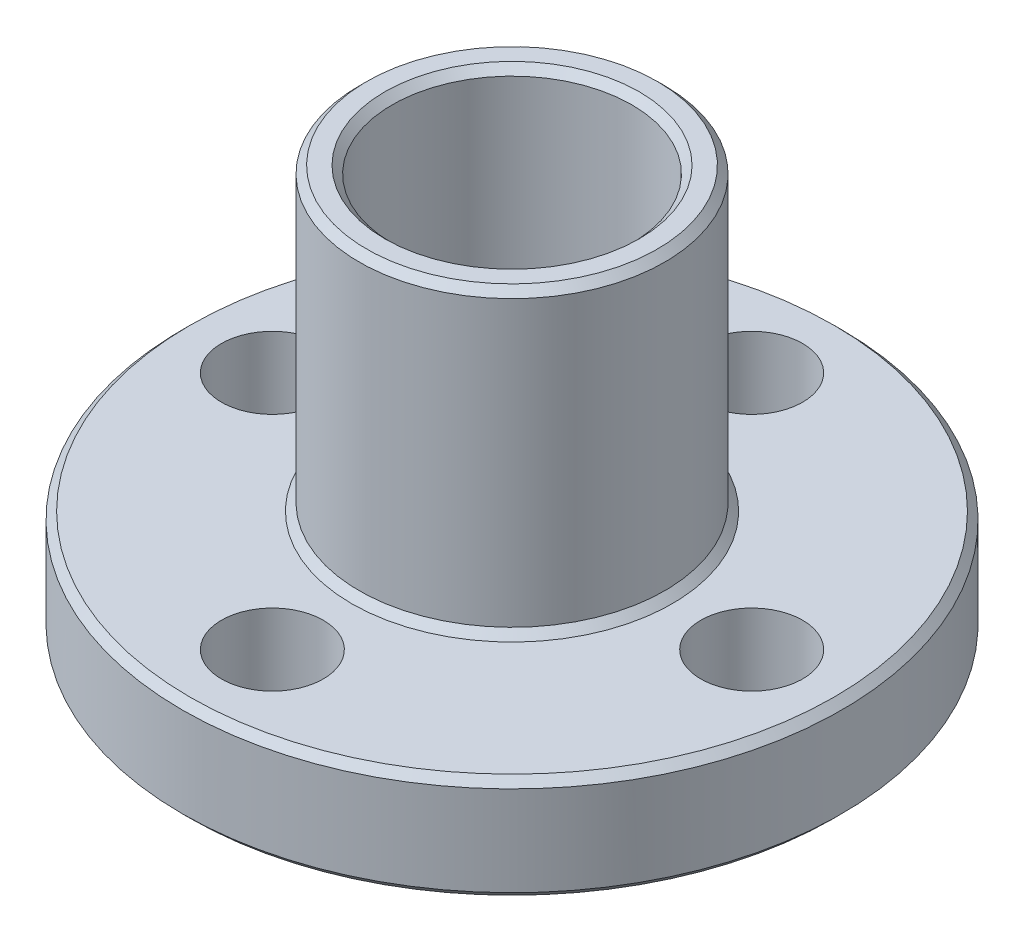
ISO-10303-21;
HEADER;
FILE_DESCRIPTION(('STEP AP214'),'2;1');
FILE_NAME('part.step','',(''),(''),'','','');
FILE_SCHEMA(('AUTOMOTIVE_DESIGN { 1 0 10303 214 1 1 1 1 }'));
ENDSEC;
DATA;
#1=APPLICATION_CONTEXT('core data for automotive mechanical design processes');
#2=APPLICATION_PROTOCOL_DEFINITION('international standard','automotive_design',2000,#1);
#3=PRODUCT_CONTEXT('',#1,'mechanical');
#4=PRODUCT('Part','Part','',(#3));
#5=PRODUCT_RELATED_PRODUCT_CATEGORY('part','',(#4));
#6=PRODUCT_DEFINITION_FORMATION('','',#4);
#7=PRODUCT_DEFINITION_CONTEXT('part definition',#1,'design');
#8=PRODUCT_DEFINITION('design','',#6,#7);
#9=PRODUCT_DEFINITION_SHAPE('','',#8);
#10=(LENGTH_UNIT() NAMED_UNIT(*) SI_UNIT(.MILLI.,.METRE.));
#11=(NAMED_UNIT(*) PLANE_ANGLE_UNIT() SI_UNIT($,.RADIAN.));
#12=(NAMED_UNIT(*) SI_UNIT($,.STERADIAN.) SOLID_ANGLE_UNIT());
#13=UNCERTAINTY_MEASURE_WITH_UNIT(LENGTH_MEASURE(1.E-05),#10,'distance_accuracy_value','');
#14=(GEOMETRIC_REPRESENTATION_CONTEXT(3) GLOBAL_UNCERTAINTY_ASSIGNED_CONTEXT((#13)) GLOBAL_UNIT_ASSIGNED_CONTEXT((#10,
#11,#12)) REPRESENTATION_CONTEXT('',''));
#15=CARTESIAN_POINT('',(0.,0.,0.));
#16=DIRECTION('',(0.,0.,1.));
#17=DIRECTION('',(1.,0.,0.));
#18=AXIS2_PLACEMENT_3D('',#15,#16,#17);
#19=CARTESIAN_POINT('',(0.,0.,0.));
#20=DIRECTION('',(0.,1.,0.));
#21=DIRECTION('',(0.,0.,1.));
#22=AXIS2_PLACEMENT_3D('',#19,#20,#21);
#23=PLANE('',#22);
#24=CARTESIAN_POINT('',(0.,0.,0.));
#25=DIRECTION('',(0.,1.,0.));
#26=DIRECTION('',(0.,0.,1.));
#27=AXIS2_PLACEMENT_3D('',#24,#25,#26);
#28=CIRCLE('',#27,4.85000000000033);
#29=CARTESIAN_POINT('',(0.,0.,4.85000000000033));
#30=VERTEX_POINT('',#29);
#31=EDGE_CURVE('E65',#30,#30,#28,.F.);
#32=ORIENTED_EDGE('',*,*,#31,.T.);
#33=EDGE_LOOP('',(#32));
#34=FACE_BOUND('',#33,.T.);
#35=CARTESIAN_POINT('',(0.,0.,0.));
#36=DIRECTION('',(0.,1.,0.));
#37=DIRECTION('',(0.,0.,1.));
#38=AXIS2_PLACEMENT_3D('',#35,#36,#37);
#39=CIRCLE('',#38,4.);
#40=CARTESIAN_POINT('',(0.,0.,4.));
#41=VERTEX_POINT('',#40);
#42=EDGE_CURVE('E92',#41,#41,#39,.T.);
#43=ORIENTED_EDGE('',*,*,#42,.T.);
#44=EDGE_LOOP('',(#43));
#45=FACE_BOUND('',#44,.T.);
#46=ADVANCED_FACE('F41',(#34,#45),#23,.F.);
#47=CARTESIAN_POINT('',(0.,0.,0.));
#48=DIRECTION('',(0.,1.,0.));
#49=DIRECTION('',(0.,0.,1.));
#50=AXIS2_PLACEMENT_3D('',#47,#48,#49);
#51=CYLINDRICAL_SURFACE('',#50,5.10000000000032);
#52=CARTESIAN_POINT('',(0.,1.25000000000001,0.));
#53=DIRECTION('',(0.,1.,0.));
#54=DIRECTION('',(0.,0.,1.));
#55=AXIS2_PLACEMENT_3D('',#52,#53,#54);
#56=CIRCLE('',#55,5.10000000000032);
#57=CARTESIAN_POINT('',(0.,1.25000000000001,5.10000000000032));
#58=VERTEX_POINT('',#57);
#59=EDGE_CURVE('E68',#58,#58,#56,.F.);
#60=ORIENTED_EDGE('',*,*,#59,.T.);
#61=EDGE_LOOP('',(#60));
#62=FACE_BOUND('',#61,.T.);
#63=CARTESIAN_POINT('',(0.,0.249999999999995,0.));
#64=DIRECTION('',(0.,1.,0.));
#65=DIRECTION('',(0.,0.,1.));
#66=AXIS2_PLACEMENT_3D('',#63,#64,#65);
#67=CIRCLE('',#66,5.10000000000032);
#68=CARTESIAN_POINT('',(0.,0.249999999999995,5.10000000000032));
#69=VERTEX_POINT('',#68);
#70=EDGE_CURVE('E71',#69,#69,#67,.T.);
#71=ORIENTED_EDGE('',*,*,#70,.T.);
#72=EDGE_LOOP('',(#71));
#73=FACE_BOUND('',#72,.T.);
#74=ADVANCED_FACE('F127',(#62,#73),#51,.T.);
#75=CARTESIAN_POINT('',(5.10000000000032,1.5,0.));
#76=DIRECTION('',(0.,1.,0.));
#77=DIRECTION('',(0.,0.,1.));
#78=AXIS2_PLACEMENT_3D('',#75,#76,#77);
#79=PLANE('',#78);
#80=CARTESIAN_POINT('',(0.,1.5,0.));
#81=DIRECTION('',(0.,1.,0.));
#82=DIRECTION('',(0.,0.,1.));
#83=AXIS2_PLACEMENT_3D('',#80,#81,#82);
#84=CIRCLE('',#83,5.35000000000032);
#85=CARTESIAN_POINT('',(0.,1.5,5.35000000000032));
#86=VERTEX_POINT('',#85);
#87=EDGE_CURVE('E74',#86,#86,#84,.T.);
#88=ORIENTED_EDGE('',*,*,#87,.T.);
#89=EDGE_LOOP('',(#88));
#90=FACE_BOUND('',#89,.T.);
#91=CARTESIAN_POINT('',(0.,1.5,0.));
#92=DIRECTION('',(0.,1.,0.));
#93=DIRECTION('',(0.,0.,1.));
#94=AXIS2_PLACEMENT_3D('',#91,#92,#93);
#95=CIRCLE('',#94,10.75);
#96=CARTESIAN_POINT('',(0.,1.5,10.75));
#97=VERTEX_POINT('',#96);
#98=EDGE_CURVE('E77',#97,#97,#95,.F.);
#99=ORIENTED_EDGE('',*,*,#98,.T.);
#100=EDGE_LOOP('',(#99));
#101=FACE_BOUND('',#100,.T.);
#102=CARTESIAN_POINT('',(0.,1.5,8.));
#103=DIRECTION('',(0.,-1.,0.));
#104=DIRECTION('',(0.,0.,-1.));
#105=AXIS2_PLACEMENT_3D('',#102,#103,#104);
#106=CIRCLE('',#105,1.7);
#107=CARTESIAN_POINT('',(0.,1.5,6.3));
#108=VERTEX_POINT('',#107);
#109=EDGE_CURVE('E97',#108,#108,#106,.T.);
#110=ORIENTED_EDGE('',*,*,#109,.F.);
#111=EDGE_LOOP('',(#110));
#112=FACE_BOUND('',#111,.T.);
#113=CARTESIAN_POINT('',(8.,1.5,0.));
#114=DIRECTION('',(0.,-1.,0.));
#115=DIRECTION('',(0.,0.,-1.));
#116=AXIS2_PLACEMENT_3D('',#113,#114,#115);
#117=CIRCLE('',#116,1.7);
#118=CARTESIAN_POINT('',(8.,1.5,-1.7));
#119=VERTEX_POINT('',#118);
#120=EDGE_CURVE('E96',#119,#119,#117,.T.);
#121=ORIENTED_EDGE('',*,*,#120,.F.);
#122=EDGE_LOOP('',(#121));
#123=FACE_BOUND('',#122,.T.);
#124=CARTESIAN_POINT('',(0.,1.5,-8.));
#125=DIRECTION('',(0.,-1.,0.));
#126=DIRECTION('',(0.,0.,-1.));
#127=AXIS2_PLACEMENT_3D('',#124,#125,#126);
#128=CIRCLE('',#127,1.7);
#129=CARTESIAN_POINT('',(0.,1.5,-9.7));
#130=VERTEX_POINT('',#129);
#131=EDGE_CURVE('E101',#130,#130,#128,.T.);
#132=ORIENTED_EDGE('',*,*,#131,.F.);
#133=EDGE_LOOP('',(#132));
#134=FACE_BOUND('',#133,.T.);
#135=CARTESIAN_POINT('',(-8.,1.5,0.));
#136=DIRECTION('',(0.,-1.,0.));
#137=DIRECTION('',(0.,0.,-1.));
#138=AXIS2_PLACEMENT_3D('',#135,#136,#137);
#139=CIRCLE('',#138,1.7);
#140=CARTESIAN_POINT('',(-8.,1.5,-1.7));
#141=VERTEX_POINT('',#140);
#142=EDGE_CURVE('E105',#141,#141,#139,.T.);
#143=ORIENTED_EDGE('',*,*,#142,.F.);
#144=EDGE_LOOP('',(#143));
#145=FACE_BOUND('',#144,.T.);
#146=ADVANCED_FACE('F123',(#90,#101,#112,#123,#134,#145),#79,.F.);
#147=CARTESIAN_POINT('',(0.,0.,0.));
#148=DIRECTION('',(0.,1.,0.));
#149=DIRECTION('',(0.,0.,1.));
#150=AXIS2_PLACEMENT_3D('',#147,#148,#149);
#151=CYLINDRICAL_SURFACE('',#150,11.);
#152=CARTESIAN_POINT('',(0.,1.75000000000001,0.));
#153=DIRECTION('',(0.,1.,0.));
#154=DIRECTION('',(0.,0.,1.));
#155=AXIS2_PLACEMENT_3D('',#152,#153,#154);
#156=CIRCLE('',#155,11.);
#157=CARTESIAN_POINT('',(0.,1.75000000000001,11.));
#158=VERTEX_POINT('',#157);
#159=EDGE_CURVE('E57',#158,#158,#156,.T.);
#160=ORIENTED_EDGE('',*,*,#159,.T.);
#161=EDGE_LOOP('',(#160));
#162=FACE_BOUND('',#161,.T.);
#163=CARTESIAN_POINT('',(0.,4.75,0.));
#164=DIRECTION('',(0.,-1.,0.));
#165=DIRECTION('',(0.,0.,-1.));
#166=AXIS2_PLACEMENT_3D('',#163,#164,#165);
#167=CIRCLE('',#166,11.);
#168=CARTESIAN_POINT('',(0.,4.75,-11.));
#169=VERTEX_POINT('',#168);
#170=EDGE_CURVE('E62',#169,#169,#167,.T.);
#171=ORIENTED_EDGE('',*,*,#170,.T.);
#172=EDGE_LOOP('',(#171));
#173=FACE_BOUND('',#172,.T.);
#174=ADVANCED_FACE('F126',(#162,#173),#151,.T.);
#175=CARTESIAN_POINT('',(11.,5.,0.));
#176=DIRECTION('',(0.,-1.,0.));
#177=DIRECTION('',(0.,0.,-1.));
#178=AXIS2_PLACEMENT_3D('',#175,#176,#177);
#179=PLANE('',#178);
#180=CARTESIAN_POINT('',(0.,5.,0.));
#181=DIRECTION('',(0.,-1.,0.));
#182=DIRECTION('',(0.,0.,-1.));
#183=AXIS2_PLACEMENT_3D('',#180,#181,#182);
#184=CIRCLE('',#183,5.35000000000032);
#185=CARTESIAN_POINT('',(0.,5.,-5.35000000000032));
#186=VERTEX_POINT('',#185);
#187=EDGE_CURVE('E80',#186,#186,#184,.T.);
#188=ORIENTED_EDGE('',*,*,#187,.T.);
#189=EDGE_LOOP('',(#188));
#190=FACE_BOUND('',#189,.T.);
#191=CARTESIAN_POINT('',(0.,5.,0.));
#192=DIRECTION('',(0.,-1.,0.));
#193=DIRECTION('',(0.,0.,-1.));
#194=AXIS2_PLACEMENT_3D('',#191,#192,#193);
#195=CIRCLE('',#194,10.75);
#196=CARTESIAN_POINT('',(0.,5.,-10.75));
#197=VERTEX_POINT('',#196);
#198=EDGE_CURVE('E83',#197,#197,#195,.F.);
#199=ORIENTED_EDGE('',*,*,#198,.T.);
#200=EDGE_LOOP('',(#199));
#201=FACE_BOUND('',#200,.T.);
#202=CARTESIAN_POINT('',(0.,5.,8.));
#203=DIRECTION('',(0.,-1.,0.));
#204=DIRECTION('',(0.,0.,-1.));
#205=AXIS2_PLACEMENT_3D('',#202,#203,#204);
#206=CIRCLE('',#205,1.7);
#207=CARTESIAN_POINT('',(0.,5.,6.3));
#208=VERTEX_POINT('',#207);
#209=EDGE_CURVE('E93',#208,#208,#206,.T.);
#210=ORIENTED_EDGE('',*,*,#209,.T.);
#211=EDGE_LOOP('',(#210));
#212=FACE_BOUND('',#211,.T.);
#213=CARTESIAN_POINT('',(8.,5.,0.));
#214=DIRECTION('',(0.,-1.,0.));
#215=DIRECTION('',(0.,0.,-1.));
#216=AXIS2_PLACEMENT_3D('',#213,#214,#215);
#217=CIRCLE('',#216,1.7);
#218=CARTESIAN_POINT('',(8.,5.,-1.7));
#219=VERTEX_POINT('',#218);
#220=EDGE_CURVE('E98',#219,#219,#217,.T.);
#221=ORIENTED_EDGE('',*,*,#220,.T.);
#222=EDGE_LOOP('',(#221));
#223=FACE_BOUND('',#222,.T.);
#224=CARTESIAN_POINT('',(0.,5.,-8.));
#225=DIRECTION('',(0.,-1.,0.));
#226=DIRECTION('',(0.,0.,-1.));
#227=AXIS2_PLACEMENT_3D('',#224,#225,#226);
#228=CIRCLE('',#227,1.7);
#229=CARTESIAN_POINT('',(0.,5.,-9.7));
#230=VERTEX_POINT('',#229);
#231=EDGE_CURVE('E102',#230,#230,#228,.T.);
#232=ORIENTED_EDGE('',*,*,#231,.T.);
#233=EDGE_LOOP('',(#232));
#234=FACE_BOUND('',#233,.T.);
#235=CARTESIAN_POINT('',(-8.,5.,0.));
#236=DIRECTION('',(0.,-1.,0.));
#237=DIRECTION('',(0.,0.,-1.));
#238=AXIS2_PLACEMENT_3D('',#235,#236,#237);
#239=CIRCLE('',#238,1.7);
#240=CARTESIAN_POINT('',(-8.,5.,-1.7));
#241=VERTEX_POINT('',#240);
#242=EDGE_CURVE('E106',#241,#241,#239,.T.);
#243=ORIENTED_EDGE('',*,*,#242,.T.);
#244=EDGE_LOOP('',(#243));
#245=FACE_BOUND('',#244,.T.);
#246=ADVANCED_FACE('F144',(#190,#201,#212,#223,#234,#245),#179,.F.);
#247=CARTESIAN_POINT('',(0.,0.,0.));
#248=DIRECTION('',(0.,1.,0.));
#249=DIRECTION('',(0.,0.,1.));
#250=AXIS2_PLACEMENT_3D('',#247,#248,#249);
#251=CYLINDRICAL_SURFACE('',#250,5.10000000000032);
#252=CARTESIAN_POINT('',(0.,5.25,0.));
#253=DIRECTION('',(0.,-1.,0.));
#254=DIRECTION('',(0.,0.,-1.));
#255=AXIS2_PLACEMENT_3D('',#252,#253,#254);
#256=CIRCLE('',#255,5.10000000000032);
#257=CARTESIAN_POINT('',(0.,5.25,-5.10000000000032));
#258=VERTEX_POINT('',#257);
#259=EDGE_CURVE('E86',#258,#258,#256,.F.);
#260=ORIENTED_EDGE('',*,*,#259,.T.);
#261=EDGE_LOOP('',(#260));
#262=FACE_BOUND('',#261,.T.);
#263=CARTESIAN_POINT('',(0.,14.75,0.));
#264=DIRECTION('',(0.,-1.,0.));
#265=DIRECTION('',(0.,0.,-1.));
#266=AXIS2_PLACEMENT_3D('',#263,#264,#265);
#267=CIRCLE('',#266,5.10000000000032);
#268=CARTESIAN_POINT('',(0.,14.75,-5.10000000000032));
#269=VERTEX_POINT('',#268);
#270=EDGE_CURVE('E89',#269,#269,#267,.T.);
#271=ORIENTED_EDGE('',*,*,#270,.T.);
#272=EDGE_LOOP('',(#271));
#273=FACE_BOUND('',#272,.T.);
#274=ADVANCED_FACE('F146',(#262,#273),#251,.T.);
#275=CARTESIAN_POINT('',(5.10000000000032,15.,0.));
#276=DIRECTION('',(0.,-1.,0.));
#277=DIRECTION('',(0.,0.,-1.));
#278=AXIS2_PLACEMENT_3D('',#275,#276,#277);
#279=PLANE('',#278);
#280=CARTESIAN_POINT('',(0.,15.,0.));
#281=DIRECTION('',(0.,-1.,0.));
#282=DIRECTION('',(0.,0.,-1.));
#283=AXIS2_PLACEMENT_3D('',#280,#281,#282);
#284=CIRCLE('',#283,4.25);
#285=CARTESIAN_POINT('',(0.,15.,-4.25));
#286=VERTEX_POINT('',#285);
#287=EDGE_CURVE('E49',#286,#286,#284,.T.);
#288=ORIENTED_EDGE('',*,*,#287,.T.);
#289=EDGE_LOOP('',(#288));
#290=FACE_BOUND('',#289,.T.);
#291=CARTESIAN_POINT('',(0.,15.,0.));
#292=DIRECTION('',(0.,-1.,0.));
#293=DIRECTION('',(0.,0.,-1.));
#294=AXIS2_PLACEMENT_3D('',#291,#292,#293);
#295=CIRCLE('',#294,4.85000000000033);
#296=CARTESIAN_POINT('',(0.,15.,-4.85000000000033));
#297=VERTEX_POINT('',#296);
#298=EDGE_CURVE('E53',#297,#297,#295,.F.);
#299=ORIENTED_EDGE('',*,*,#298,.T.);
#300=EDGE_LOOP('',(#299));
#301=FACE_BOUND('',#300,.T.);
#302=ADVANCED_FACE('F153',(#290,#301),#279,.F.);
#303=CARTESIAN_POINT('',(0.,15.,0.));
#304=DIRECTION('',(0.,-1.,0.));
#305=DIRECTION('',(0.,0.,-1.));
#306=AXIS2_PLACEMENT_3D('',#303,#304,#305);
#307=CYLINDRICAL_SURFACE('',#306,4.);
#308=CARTESIAN_POINT('',(0.,14.75,0.));
#309=DIRECTION('',(0.,-1.,0.));
#310=DIRECTION('',(0.,0.,-1.));
#311=AXIS2_PLACEMENT_3D('',#308,#309,#310);
#312=CIRCLE('',#311,4.);
#313=CARTESIAN_POINT('',(0.,14.75,-4.));
#314=VERTEX_POINT('',#313);
#315=EDGE_CURVE('E10',#314,#314,#312,.F.);
#316=ORIENTED_EDGE('',*,*,#315,.T.);
#317=EDGE_LOOP('',(#316));
#318=FACE_BOUND('',#317,.T.);
#319=ORIENTED_EDGE('',*,*,#42,.F.);
#320=EDGE_LOOP('',(#319));
#321=FACE_BOUND('',#320,.T.);
#322=ADVANCED_FACE('F140',(#318,#321),#307,.F.);
#323=CARTESIAN_POINT('',(-8.,1.5,0.));
#324=DIRECTION('',(0.,-1.,0.));
#325=DIRECTION('',(0.,0.,-1.));
#326=AXIS2_PLACEMENT_3D('',#323,#324,#325);
#327=CYLINDRICAL_SURFACE('',#326,1.7);
#328=ORIENTED_EDGE('',*,*,#142,.T.);
#329=EDGE_LOOP('',(#328));
#330=FACE_BOUND('',#329,.T.);
#331=ORIENTED_EDGE('',*,*,#242,.F.);
#332=EDGE_LOOP('',(#331));
#333=FACE_BOUND('',#332,.T.);
#334=ADVANCED_FACE('F136',(#330,#333),#327,.F.);
#335=CARTESIAN_POINT('',(0.,1.5,-8.));
#336=DIRECTION('',(0.,-1.,0.));
#337=DIRECTION('',(0.,0.,-1.));
#338=AXIS2_PLACEMENT_3D('',#335,#336,#337);
#339=CYLINDRICAL_SURFACE('',#338,1.7);
#340=ORIENTED_EDGE('',*,*,#131,.T.);
#341=EDGE_LOOP('',(#340));
#342=FACE_BOUND('',#341,.T.);
#343=ORIENTED_EDGE('',*,*,#231,.F.);
#344=EDGE_LOOP('',(#343));
#345=FACE_BOUND('',#344,.T.);
#346=ADVANCED_FACE('F139',(#342,#345),#339,.F.);
#347=CARTESIAN_POINT('',(8.,1.5,0.));
#348=DIRECTION('',(0.,-1.,0.));
#349=DIRECTION('',(0.,0.,-1.));
#350=AXIS2_PLACEMENT_3D('',#347,#348,#349);
#351=CYLINDRICAL_SURFACE('',#350,1.7);
#352=ORIENTED_EDGE('',*,*,#120,.T.);
#353=EDGE_LOOP('',(#352));
#354=FACE_BOUND('',#353,.T.);
#355=ORIENTED_EDGE('',*,*,#220,.F.);
#356=EDGE_LOOP('',(#355));
#357=FACE_BOUND('',#356,.T.);
#358=ADVANCED_FACE('F230',(#354,#357),#351,.F.);
#359=CARTESIAN_POINT('',(0.,1.5,8.));
#360=DIRECTION('',(0.,-1.,0.));
#361=DIRECTION('',(0.,0.,-1.));
#362=AXIS2_PLACEMENT_3D('',#359,#360,#361);
#363=CYLINDRICAL_SURFACE('',#362,1.7);
#364=ORIENTED_EDGE('',*,*,#109,.T.);
#365=EDGE_LOOP('',(#364));
#366=FACE_BOUND('',#365,.T.);
#367=ORIENTED_EDGE('',*,*,#209,.F.);
#368=EDGE_LOOP('',(#367));
#369=FACE_BOUND('',#368,.T.);
#370=ADVANCED_FACE('F120',(#366,#369),#363,.F.);
#371=CARTESIAN_POINT('',(0.,5.25,0.));
#372=DIRECTION('',(0.,-1.,0.));
#373=DIRECTION('',(0.,0.,-1.));
#374=AXIS2_PLACEMENT_3D('',#371,#372,#373);
#375=CONICAL_SURFACE('',#374,5.10000000000032,0.785398163397443);
#376=ORIENTED_EDGE('',*,*,#187,.F.);
#377=EDGE_LOOP('',(#376));
#378=FACE_BOUND('',#377,.T.);
#379=ORIENTED_EDGE('',*,*,#259,.F.);
#380=EDGE_LOOP('',(#379));
#381=FACE_BOUND('',#380,.T.);
#382=ADVANCED_FACE('F171',(#378,#381),#375,.T.);
#383=CARTESIAN_POINT('',(0.,1.5,0.));
#384=DIRECTION('',(0.,1.,0.));
#385=DIRECTION('',(0.,0.,1.));
#386=AXIS2_PLACEMENT_3D('',#383,#384,#385);
#387=CONICAL_SURFACE('',#386,5.35000000000032,0.78539816339746);
#388=ORIENTED_EDGE('',*,*,#59,.F.);
#389=EDGE_LOOP('',(#388));
#390=FACE_BOUND('',#389,.T.);
#391=ORIENTED_EDGE('',*,*,#87,.F.);
#392=EDGE_LOOP('',(#391));
#393=FACE_BOUND('',#392,.T.);
#394=ADVANCED_FACE('F177',(#390,#393),#387,.T.);
#395=CARTESIAN_POINT('',(0.,0.249999999999995,0.));
#396=DIRECTION('',(0.,1.,0.));
#397=DIRECTION('',(0.,0.,1.));
#398=AXIS2_PLACEMENT_3D('',#395,#396,#397);
#399=CONICAL_SURFACE('',#398,5.10000000000032,0.785398163397455);
#400=ORIENTED_EDGE('',*,*,#31,.F.);
#401=EDGE_LOOP('',(#400));
#402=FACE_BOUND('',#401,.T.);
#403=ORIENTED_EDGE('',*,*,#70,.F.);
#404=EDGE_LOOP('',(#403));
#405=FACE_BOUND('',#404,.T.);
#406=ADVANCED_FACE('F184',(#402,#405),#399,.T.);
#407=CARTESIAN_POINT('',(0.,1.75000000000001,0.));
#408=DIRECTION('',(0.,1.,0.));
#409=DIRECTION('',(0.,0.,1.));
#410=AXIS2_PLACEMENT_3D('',#407,#408,#409);
#411=CONICAL_SURFACE('',#410,11.,0.785398163397452);
#412=ORIENTED_EDGE('',*,*,#98,.F.);
#413=EDGE_LOOP('',(#412));
#414=FACE_BOUND('',#413,.T.);
#415=ORIENTED_EDGE('',*,*,#159,.F.);
#416=EDGE_LOOP('',(#415));
#417=FACE_BOUND('',#416,.T.);
#418=ADVANCED_FACE('F191',(#414,#417),#411,.T.);
#419=CARTESIAN_POINT('',(0.,5.,0.));
#420=DIRECTION('',(0.,-1.,0.));
#421=DIRECTION('',(0.,0.,-1.));
#422=AXIS2_PLACEMENT_3D('',#419,#420,#421);
#423=CONICAL_SURFACE('',#422,10.75,0.785398163397441);
#424=ORIENTED_EDGE('',*,*,#170,.F.);
#425=EDGE_LOOP('',(#424));
#426=FACE_BOUND('',#425,.T.);
#427=ORIENTED_EDGE('',*,*,#198,.F.);
#428=EDGE_LOOP('',(#427));
#429=FACE_BOUND('',#428,.T.);
#430=ADVANCED_FACE('F198',(#426,#429),#423,.T.);
#431=CARTESIAN_POINT('',(0.,15.,0.));
#432=DIRECTION('',(0.,1.,0.));
#433=DIRECTION('',(0.,0.,1.));
#434=AXIS2_PLACEMENT_3D('',#431,#432,#433);
#435=CONICAL_SURFACE('',#434,4.25,0.785398163397448);
#436=ORIENTED_EDGE('',*,*,#315,.F.);
#437=EDGE_LOOP('',(#436));
#438=FACE_BOUND('',#437,.T.);
#439=ORIENTED_EDGE('',*,*,#287,.F.);
#440=EDGE_LOOP('',(#439));
#441=FACE_BOUND('',#440,.T.);
#442=ADVANCED_FACE('F204',(#438,#441),#435,.F.);
#443=CARTESIAN_POINT('',(0.,15.,0.));
#444=DIRECTION('',(0.,-1.,0.));
#445=DIRECTION('',(0.,0.,-1.));
#446=AXIS2_PLACEMENT_3D('',#443,#444,#445);
#447=CONICAL_SURFACE('',#446,4.85000000000033,0.785398163397448);
#448=ORIENTED_EDGE('',*,*,#270,.F.);
#449=EDGE_LOOP('',(#448));
#450=FACE_BOUND('',#449,.T.);
#451=ORIENTED_EDGE('',*,*,#298,.F.);
#452=EDGE_LOOP('',(#451));
#453=FACE_BOUND('',#452,.T.);
#454=ADVANCED_FACE('F44',(#450,#453),#447,.T.);
#455=CLOSED_SHELL('',(#46,#74,#146,#174,#246,#274,#302,#322,#334,#346,#358,#370,#382,#394,#406,
#418,#430,#442,#454));
#456=MANIFOLD_SOLID_BREP('B2',#455);
#457=ADVANCED_BREP_SHAPE_REPRESENTATION('',(#18,#456),#14);
#458=SHAPE_DEFINITION_REPRESENTATION(#9,#457);
ENDSEC;
END-ISO-10303-21;
